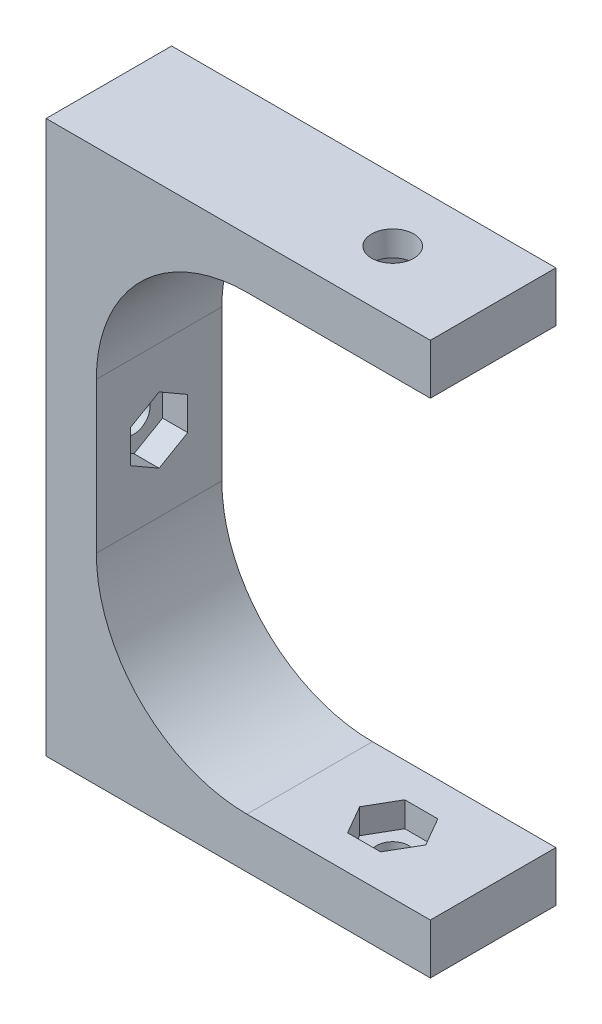
ISO-10303-21;
HEADER;
FILE_DESCRIPTION(('STEP AP214'),'2;1');
FILE_NAME('part.step','',(''),(''),'','','');
FILE_SCHEMA(('AUTOMOTIVE_DESIGN { 1 0 10303 214 1 1 1 1 }'));
ENDSEC;
DATA;
#1=APPLICATION_CONTEXT('core data for automotive mechanical design processes');
#2=APPLICATION_PROTOCOL_DEFINITION('international standard','automotive_design',2000,#1);
#3=PRODUCT_CONTEXT('',#1,'mechanical');
#4=PRODUCT('Part','Part','',(#3));
#5=PRODUCT_RELATED_PRODUCT_CATEGORY('part','',(#4));
#6=PRODUCT_DEFINITION_FORMATION('','',#4);
#7=PRODUCT_DEFINITION_CONTEXT('part definition',#1,'design');
#8=PRODUCT_DEFINITION('design','',#6,#7);
#9=PRODUCT_DEFINITION_SHAPE('','',#8);
#10=(LENGTH_UNIT() NAMED_UNIT(*) SI_UNIT(.MILLI.,.METRE.));
#11=(NAMED_UNIT(*) PLANE_ANGLE_UNIT() SI_UNIT($,.RADIAN.));
#12=(NAMED_UNIT(*) SI_UNIT($,.STERADIAN.) SOLID_ANGLE_UNIT());
#13=UNCERTAINTY_MEASURE_WITH_UNIT(LENGTH_MEASURE(1.E-05),#10,'distance_accuracy_value','');
#14=(GEOMETRIC_REPRESENTATION_CONTEXT(3) GLOBAL_UNCERTAINTY_ASSIGNED_CONTEXT((#13)) GLOBAL_UNIT_ASSIGNED_CONTEXT((#10,
#11,#12)) REPRESENTATION_CONTEXT('',''));
#15=CARTESIAN_POINT('',(0.,0.,0.));
#16=DIRECTION('',(0.,0.,1.));
#17=DIRECTION('',(1.,0.,0.));
#18=AXIS2_PLACEMENT_3D('',#15,#16,#17);
#19=CARTESIAN_POINT('',(0.,0.,6.25));
#20=DIRECTION('',(1.,0.,0.));
#21=DIRECTION('',(0.,1.,0.));
#22=AXIS2_PLACEMENT_3D('',#19,#20,#21);
#23=CYLINDRICAL_SURFACE('',#22,1.6);
#24=CARTESIAN_POINT('',(0.,0.,6.25));
#25=DIRECTION('',(1.,0.,0.));
#26=DIRECTION('',(0.,1.,0.));
#27=AXIS2_PLACEMENT_3D('',#24,#25,#26);
#28=CIRCLE('',#27,1.6);
#29=CARTESIAN_POINT('',(0.,1.60000000000005,6.25));
#30=VERTEX_POINT('',#29);
#31=EDGE_CURVE('E304',#30,#30,#28,.T.);
#32=ORIENTED_EDGE('',*,*,#31,.F.);
#33=EDGE_LOOP('',(#32));
#34=FACE_BOUND('',#33,.T.);
#35=CARTESIAN_POINT('',(2.50000000000001,0.,6.25));
#36=DIRECTION('',(1.,0.,0.));
#37=DIRECTION('',(0.,0.,-1.));
#38=AXIS2_PLACEMENT_3D('',#35,#36,#37);
#39=CIRCLE('',#38,1.6);
#40=CARTESIAN_POINT('',(2.50000000000001,0.,4.65));
#41=VERTEX_POINT('',#40);
#42=EDGE_CURVE('E46',#41,#41,#39,.F.);
#43=ORIENTED_EDGE('',*,*,#42,.F.);
#44=EDGE_LOOP('',(#43));
#45=FACE_BOUND('',#44,.T.);
#46=ADVANCED_FACE('F42',(#34,#45),#23,.F.);
#47=CARTESIAN_POINT('',(28.2666666666667,-27.5,6.25));
#48=DIRECTION('',(0.,1.,0.));
#49=DIRECTION('',(-1.,0.,0.));
#50=AXIS2_PLACEMENT_3D('',#47,#48,#49);
#51=CYLINDRICAL_SURFACE('',#50,1.6);
#52=CARTESIAN_POINT('',(28.2666666666667,-27.5,6.25));
#53=DIRECTION('',(0.,1.,0.));
#54=DIRECTION('',(-1.,0.,0.));
#55=AXIS2_PLACEMENT_3D('',#52,#53,#54);
#56=CIRCLE('',#55,1.6);
#57=CARTESIAN_POINT('',(26.6666666666667,-27.5,6.25));
#58=VERTEX_POINT('',#57);
#59=EDGE_CURVE('E372',#58,#58,#56,.T.);
#60=ORIENTED_EDGE('',*,*,#59,.F.);
#61=EDGE_LOOP('',(#60));
#62=FACE_BOUND('',#61,.T.);
#63=CARTESIAN_POINT('',(28.2666666666667,-25.,6.25));
#64=DIRECTION('',(0.,1.,0.));
#65=DIRECTION('',(0.,0.,1.));
#66=AXIS2_PLACEMENT_3D('',#63,#64,#65);
#67=CIRCLE('',#66,1.6);
#68=CARTESIAN_POINT('',(28.2666666666667,-25.,7.85));
#69=VERTEX_POINT('',#68);
#70=EDGE_CURVE('E357',#69,#69,#67,.F.);
#71=ORIENTED_EDGE('',*,*,#70,.F.);
#72=EDGE_LOOP('',(#71));
#73=FACE_BOUND('',#72,.T.);
#74=ADVANCED_FACE('F554',(#62,#73),#51,.F.);
#75=CARTESIAN_POINT('',(28.2666666666667,16.560303038033,6.25));
#76=DIRECTION('',(0.,1.,0.));
#77=DIRECTION('',(0.,0.,1.));
#78=AXIS2_PLACEMENT_3D('',#75,#76,#77);
#79=CYLINDRICAL_SURFACE('',#78,2.1);
#80=CARTESIAN_POINT('',(28.2666666666667,27.5,6.25));
#81=DIRECTION('',(0.,1.,0.));
#82=DIRECTION('',(0.,0.,1.));
#83=AXIS2_PLACEMENT_3D('',#80,#81,#82);
#84=CIRCLE('',#83,2.1);
#85=CARTESIAN_POINT('',(28.2666666666667,27.5,8.35));
#86=VERTEX_POINT('',#85);
#87=EDGE_CURVE('E443',#86,#86,#84,.T.);
#88=ORIENTED_EDGE('',*,*,#87,.T.);
#89=EDGE_LOOP('',(#88));
#90=FACE_BOUND('',#89,.T.);
#91=CARTESIAN_POINT('',(28.2666666666667,25.,6.25));
#92=DIRECTION('',(0.,-1.,0.));
#93=DIRECTION('',(0.,0.,-1.));
#94=AXIS2_PLACEMENT_3D('',#91,#92,#93);
#95=CIRCLE('',#94,2.1);
#96=CARTESIAN_POINT('',(28.2666666666667,25.,4.15));
#97=VERTEX_POINT('',#96);
#98=EDGE_CURVE('E427',#97,#97,#95,.F.);
#99=ORIENTED_EDGE('',*,*,#98,.F.);
#100=EDGE_LOOP('',(#99));
#101=FACE_BOUND('',#100,.T.);
#102=ADVANCED_FACE('F556',(#90,#101),#79,.F.);
#103=CARTESIAN_POINT('',(0.,27.5,12.5));
#104=DIRECTION('',(0.,-1.,0.));
#105=DIRECTION('',(0.,0.,-1.));
#106=AXIS2_PLACEMENT_3D('',#103,#104,#105);
#107=PLANE('',#106);
#108=ORIENTED_EDGE('',*,*,#87,.F.);
#109=EDGE_LOOP('',(#108));
#110=FACE_BOUND('',#109,.T.);
#111=DIRECTION('',(-1.,0.,0.));
#112=VECTOR('',#111,1.);
#113=CARTESIAN_POINT('',(0.,27.5,0.));
#114=LINE('',#113,#112);
#115=CARTESIAN_POINT('',(38.2666666666667,27.5,0.));
#116=VERTEX_POINT('',#115);
#117=CARTESIAN_POINT('',(0.,27.5,0.));
#118=VERTEX_POINT('',#117);
#119=EDGE_CURVE('E447',#116,#118,#114,.T.);
#120=ORIENTED_EDGE('',*,*,#119,.T.);
#121=DIRECTION('',(0.,0.,-1.));
#122=VECTOR('',#121,1.);
#123=CARTESIAN_POINT('',(0.,27.5,12.5));
#124=LINE('',#123,#122);
#125=CARTESIAN_POINT('',(0.,27.5,12.5));
#126=VERTEX_POINT('',#125);
#127=EDGE_CURVE('E520',#126,#118,#124,.T.);
#128=ORIENTED_EDGE('',*,*,#127,.F.);
#129=DIRECTION('',(-1.,0.,0.));
#130=VECTOR('',#129,1.);
#131=CARTESIAN_POINT('',(0.,27.5,12.5));
#132=LINE('',#131,#130);
#133=CARTESIAN_POINT('',(38.2666666666667,27.5,12.5));
#134=VERTEX_POINT('',#133);
#135=EDGE_CURVE('E448',#134,#126,#132,.T.);
#136=ORIENTED_EDGE('',*,*,#135,.F.);
#137=DIRECTION('',(0.,0.,-1.));
#138=VECTOR('',#137,1.);
#139=CARTESIAN_POINT('',(38.2666666666667,27.5,12.5));
#140=LINE('',#139,#138);
#141=EDGE_CURVE('E476',#134,#116,#140,.T.);
#142=ORIENTED_EDGE('',*,*,#141,.T.);
#143=EDGE_LOOP('',(#120,#128,#136,#142));
#144=FACE_BOUND('',#143,.T.);
#145=ADVANCED_FACE('F563',(#110,#144),#107,.F.);
#146=CARTESIAN_POINT('',(0.,-27.5,12.5));
#147=DIRECTION('',(1.,0.,0.));
#148=DIRECTION('',(0.,0.,-1.));
#149=AXIS2_PLACEMENT_3D('',#146,#147,#148);
#150=PLANE('',#149);
#151=ORIENTED_EDGE('',*,*,#31,.T.);
#152=EDGE_LOOP('',(#151));
#153=FACE_BOUND('',#152,.T.);
#154=DIRECTION('',(0.,-1.,0.));
#155=VECTOR('',#154,1.);
#156=CARTESIAN_POINT('',(0.,-27.5,0.));
#157=LINE('',#156,#155);
#158=CARTESIAN_POINT('',(0.,-27.5,0.));
#159=VERTEX_POINT('',#158);
#160=EDGE_CURVE('E479',#118,#159,#157,.T.);
#161=ORIENTED_EDGE('',*,*,#160,.T.);
#162=DIRECTION('',(0.,0.,-1.));
#163=VECTOR('',#162,1.);
#164=CARTESIAN_POINT('',(0.,-27.5,12.5));
#165=LINE('',#164,#163);
#166=CARTESIAN_POINT('',(0.,-27.5,12.5));
#167=VERTEX_POINT('',#166);
#168=EDGE_CURVE('E516',#167,#159,#165,.T.);
#169=ORIENTED_EDGE('',*,*,#168,.F.);
#170=DIRECTION('',(0.,-1.,0.));
#171=VECTOR('',#170,1.);
#172=CARTESIAN_POINT('',(0.,-27.5,12.5));
#173=LINE('',#172,#171);
#174=EDGE_CURVE('E452',#126,#167,#173,.T.);
#175=ORIENTED_EDGE('',*,*,#174,.F.);
#176=ORIENTED_EDGE('',*,*,#127,.T.);
#177=EDGE_LOOP('',(#161,#169,#175,#176));
#178=FACE_BOUND('',#177,.T.);
#179=ADVANCED_FACE('F633',(#153,#178),#150,.F.);
#180=CARTESIAN_POINT('',(38.2666666666667,-27.5,12.5));
#181=DIRECTION('',(0.,1.,0.));
#182=DIRECTION('',(-1.,0.,0.));
#183=AXIS2_PLACEMENT_3D('',#180,#181,#182);
#184=PLANE('',#183);
#185=ORIENTED_EDGE('',*,*,#59,.T.);
#186=EDGE_LOOP('',(#185));
#187=FACE_BOUND('',#186,.T.);
#188=DIRECTION('',(1.,0.,0.));
#189=VECTOR('',#188,1.);
#190=CARTESIAN_POINT('',(38.2666666666667,-27.5,0.));
#191=LINE('',#190,#189);
#192=CARTESIAN_POINT('',(38.2666666666667,-27.5,0.));
#193=VERTEX_POINT('',#192);
#194=EDGE_CURVE('E482',#159,#193,#191,.T.);
#195=ORIENTED_EDGE('',*,*,#194,.T.);
#196=DIRECTION('',(0.,0.,-1.));
#197=VECTOR('',#196,1.);
#198=CARTESIAN_POINT('',(38.2666666666667,-27.5,12.5));
#199=LINE('',#198,#197);
#200=CARTESIAN_POINT('',(38.2666666666667,-27.5,12.5));
#201=VERTEX_POINT('',#200);
#202=EDGE_CURVE('E512',#201,#193,#199,.T.);
#203=ORIENTED_EDGE('',*,*,#202,.F.);
#204=DIRECTION('',(1.,0.,0.));
#205=VECTOR('',#204,1.);
#206=CARTESIAN_POINT('',(38.2666666666667,-27.5,12.5));
#207=LINE('',#206,#205);
#208=EDGE_CURVE('E456',#167,#201,#207,.T.);
#209=ORIENTED_EDGE('',*,*,#208,.F.);
#210=ORIENTED_EDGE('',*,*,#168,.T.);
#211=EDGE_LOOP('',(#195,#203,#209,#210));
#212=FACE_BOUND('',#211,.T.);
#213=ADVANCED_FACE('F629',(#187,#212),#184,.F.);
#214=CARTESIAN_POINT('',(38.2666666666667,-22.5,12.5));
#215=DIRECTION('',(-1.,0.,0.));
#216=DIRECTION('',(0.,0.,1.));
#217=AXIS2_PLACEMENT_3D('',#214,#215,#216);
#218=PLANE('',#217);
#219=DIRECTION('',(0.,1.,0.));
#220=VECTOR('',#219,1.);
#221=CARTESIAN_POINT('',(38.2666666666667,-22.5,0.));
#222=LINE('',#221,#220);
#223=CARTESIAN_POINT('',(38.2666666666667,-22.5,0.));
#224=VERTEX_POINT('',#223);
#225=EDGE_CURVE('E485',#193,#224,#222,.T.);
#226=ORIENTED_EDGE('',*,*,#225,.T.);
#227=DIRECTION('',(0.,0.,-1.));
#228=VECTOR('',#227,1.);
#229=CARTESIAN_POINT('',(38.2666666666667,-22.5,12.5));
#230=LINE('',#229,#228);
#231=CARTESIAN_POINT('',(38.2666666666667,-22.5,12.5));
#232=VERTEX_POINT('',#231);
#233=EDGE_CURVE('E508',#232,#224,#230,.T.);
#234=ORIENTED_EDGE('',*,*,#233,.F.);
#235=DIRECTION('',(0.,1.,0.));
#236=VECTOR('',#235,1.);
#237=CARTESIAN_POINT('',(38.2666666666667,-22.5,12.5));
#238=LINE('',#237,#236);
#239=EDGE_CURVE('E459',#201,#232,#238,.T.);
#240=ORIENTED_EDGE('',*,*,#239,.F.);
#241=ORIENTED_EDGE('',*,*,#202,.T.);
#242=EDGE_LOOP('',(#226,#234,#240,#241));
#243=FACE_BOUND('',#242,.T.);
#244=ADVANCED_FACE('F625',(#243),#218,.F.);
#245=CARTESIAN_POINT('',(5.00000000000001,-22.5,12.5));
#246=DIRECTION('',(0.,-1.,0.));
#247=DIRECTION('',(0.,0.,-1.));
#248=AXIS2_PLACEMENT_3D('',#245,#246,#247);
#249=PLANE('',#248);
#250=DIRECTION('',(-1.,0.,0.));
#251=VECTOR('',#250,1.);
#252=CARTESIAN_POINT('',(29.9121149338571,-22.5,3.4));
#253=LINE('',#252,#251);
#254=CARTESIAN_POINT('',(29.9121149338571,-22.5,3.4));
#255=VERTEX_POINT('',#254);
#256=CARTESIAN_POINT('',(26.6212183994762,-22.5,3.4));
#257=VERTEX_POINT('',#256);
#258=EDGE_CURVE('E335',#255,#257,#253,.T.);
#259=ORIENTED_EDGE('',*,*,#258,.F.);
#260=DIRECTION('',(-0.5,0.,-0.866025403784439));
#261=VECTOR('',#260,1.);
#262=CARTESIAN_POINT('',(31.5575632010475,-22.5,6.25));
#263=LINE('',#262,#261);
#264=CARTESIAN_POINT('',(31.5575632010475,-22.5,6.25));
#265=VERTEX_POINT('',#264);
#266=EDGE_CURVE('E68',#265,#255,#263,.T.);
#267=ORIENTED_EDGE('',*,*,#266,.F.);
#268=DIRECTION('',(0.5,0.,-0.866025403784439));
#269=VECTOR('',#268,1.);
#270=CARTESIAN_POINT('',(29.9121149338571,-22.5,9.1));
#271=LINE('',#270,#269);
#272=CARTESIAN_POINT('',(29.9121149338571,-22.5,9.1));
#273=VERTEX_POINT('',#272);
#274=EDGE_CURVE('E313',#273,#265,#271,.T.);
#275=ORIENTED_EDGE('',*,*,#274,.F.);
#276=DIRECTION('',(1.,0.,0.));
#277=VECTOR('',#276,1.);
#278=CARTESIAN_POINT('',(26.6212183994762,-22.5,9.1));
#279=LINE('',#278,#277);
#280=CARTESIAN_POINT('',(26.6212183994762,-22.5,9.1));
#281=VERTEX_POINT('',#280);
#282=EDGE_CURVE('E347',#281,#273,#279,.T.);
#283=ORIENTED_EDGE('',*,*,#282,.F.);
#284=DIRECTION('',(0.5,0.,0.866025403784438));
#285=VECTOR('',#284,1.);
#286=CARTESIAN_POINT('',(24.9757701322858,-22.5,6.25));
#287=LINE('',#286,#285);
#288=CARTESIAN_POINT('',(24.9757701322858,-22.5,6.25));
#289=VERTEX_POINT('',#288);
#290=EDGE_CURVE('E343',#289,#281,#287,.T.);
#291=ORIENTED_EDGE('',*,*,#290,.F.);
#292=DIRECTION('',(-0.5,0.,0.866025403784439));
#293=VECTOR('',#292,1.);
#294=CARTESIAN_POINT('',(26.6212183994762,-22.5,3.4));
#295=LINE('',#294,#293);
#296=EDGE_CURVE('E339',#257,#289,#295,.T.);
#297=ORIENTED_EDGE('',*,*,#296,.F.);
#298=EDGE_LOOP('',(#259,#267,#275,#283,#291,#297));
#299=FACE_BOUND('',#298,.T.);
#300=DIRECTION('',(-1.,0.,0.));
#301=VECTOR('',#300,1.);
#302=CARTESIAN_POINT('',(5.00000000000001,-22.5,0.));
#303=LINE('',#302,#301);
#304=CARTESIAN_POINT('',(20.,-22.5,0.));
#305=VERTEX_POINT('',#304);
#306=EDGE_CURVE('E488',#224,#305,#303,.T.);
#307=ORIENTED_EDGE('',*,*,#306,.T.);
#308=DIRECTION('',(0.,0.,-1.));
#309=VECTOR('',#308,1.);
#310=CARTESIAN_POINT('',(20.,-22.5,12.5));
#311=LINE('',#310,#309);
#312=CARTESIAN_POINT('',(20.,-22.5,12.5));
#313=VERTEX_POINT('',#312);
#314=EDGE_CURVE('E531',#305,#313,#311,.F.);
#315=ORIENTED_EDGE('',*,*,#314,.T.);
#316=DIRECTION('',(-1.,0.,0.));
#317=VECTOR('',#316,1.);
#318=CARTESIAN_POINT('',(5.00000000000001,-22.5,12.5));
#319=LINE('',#318,#317);
#320=EDGE_CURVE('E462',#232,#313,#319,.T.);
#321=ORIENTED_EDGE('',*,*,#320,.F.);
#322=ORIENTED_EDGE('',*,*,#233,.T.);
#323=EDGE_LOOP('',(#307,#315,#321,#322));
#324=FACE_BOUND('',#323,.T.);
#325=ADVANCED_FACE('F621',(#299,#324),#249,.F.);
#326=CARTESIAN_POINT('',(5.00000000000001,22.5,12.5));
#327=DIRECTION('',(-1.,0.,0.));
#328=DIRECTION('',(0.,0.,1.));
#329=AXIS2_PLACEMENT_3D('',#326,#327,#328);
#330=PLANE('',#329);
#331=DIRECTION('',(0.,1.,0.));
#332=VECTOR('',#331,1.);
#333=CARTESIAN_POINT('',(5.00000000000001,-1.64544826719038,3.4));
#334=LINE('',#333,#332);
#335=CARTESIAN_POINT('',(5.00000000000001,-1.64544826719038,3.4));
#336=VERTEX_POINT('',#335);
#337=CARTESIAN_POINT('',(5.00000000000001,1.64544826719049,3.4));
#338=VERTEX_POINT('',#337);
#339=EDGE_CURVE('E276',#336,#338,#334,.T.);
#340=ORIENTED_EDGE('',*,*,#339,.F.);
#341=DIRECTION('',(0.,0.500000000000001,-0.866025403784438));
#342=VECTOR('',#341,1.);
#343=CARTESIAN_POINT('',(5.00000000000001,-3.29089653438081,6.25));
#344=LINE('',#343,#342);
#345=CARTESIAN_POINT('',(5.00000000000001,-3.29089653438081,6.25));
#346=VERTEX_POINT('',#345);
#347=EDGE_CURVE('E60',#346,#336,#344,.T.);
#348=ORIENTED_EDGE('',*,*,#347,.F.);
#349=DIRECTION('',(0.,-0.5,-0.866025403784439));
#350=VECTOR('',#349,1.);
#351=CARTESIAN_POINT('',(5.00000000000001,-1.64544826719038,9.1));
#352=LINE('',#351,#350);
#353=CARTESIAN_POINT('',(5.00000000000001,-1.64544826719038,9.1));
#354=VERTEX_POINT('',#353);
#355=EDGE_CURVE('E254',#354,#346,#352,.T.);
#356=ORIENTED_EDGE('',*,*,#355,.F.);
#357=DIRECTION('',(0.,-1.,0.));
#358=VECTOR('',#357,1.);
#359=CARTESIAN_POINT('',(5.00000000000001,1.64544826719049,9.1));
#360=LINE('',#359,#358);
#361=CARTESIAN_POINT('',(5.00000000000001,1.64544826719049,9.1));
#362=VERTEX_POINT('',#361);
#363=EDGE_CURVE('E260',#362,#354,#360,.T.);
#364=ORIENTED_EDGE('',*,*,#363,.F.);
#365=DIRECTION('',(0.,-0.5,0.866025403784438));
#366=VECTOR('',#365,1.);
#367=CARTESIAN_POINT('',(5.00000000000001,3.29089653438092,6.25));
#368=LINE('',#367,#366);
#369=CARTESIAN_POINT('',(5.00000000000001,3.29089653438092,6.25));
#370=VERTEX_POINT('',#369);
#371=EDGE_CURVE('E283',#370,#362,#368,.T.);
#372=ORIENTED_EDGE('',*,*,#371,.F.);
#373=DIRECTION('',(0.,0.5,0.866025403784439));
#374=VECTOR('',#373,1.);
#375=CARTESIAN_POINT('',(5.00000000000001,1.64544826719049,3.4));
#376=LINE('',#375,#374);
#377=EDGE_CURVE('E279',#338,#370,#376,.T.);
#378=ORIENTED_EDGE('',*,*,#377,.F.);
#379=EDGE_LOOP('',(#340,#348,#356,#364,#372,#378));
#380=FACE_BOUND('',#379,.T.);
#381=DIRECTION('',(0.,1.,0.));
#382=VECTOR('',#381,1.);
#383=CARTESIAN_POINT('',(5.00000000000001,22.5,12.5));
#384=LINE('',#383,#382);
#385=CARTESIAN_POINT('',(5.00000000000001,-7.49999999999999,12.5));
#386=VERTEX_POINT('',#385);
#387=CARTESIAN_POINT('',(5.00000000000001,7.5,12.5));
#388=VERTEX_POINT('',#387);
#389=EDGE_CURVE('E466',#386,#388,#384,.T.);
#390=ORIENTED_EDGE('',*,*,#389,.F.);
#391=DIRECTION('',(0.,0.,-1.));
#392=VECTOR('',#391,1.);
#393=CARTESIAN_POINT('',(5.00000000000001,-7.5,0.));
#394=LINE('',#393,#392);
#395=CARTESIAN_POINT('',(5.00000000000001,-7.49999999999999,0.));
#396=VERTEX_POINT('',#395);
#397=EDGE_CURVE('E527',#386,#396,#394,.T.);
#398=ORIENTED_EDGE('',*,*,#397,.T.);
#399=DIRECTION('',(0.,1.,0.));
#400=VECTOR('',#399,1.);
#401=CARTESIAN_POINT('',(5.00000000000001,22.5,0.));
#402=LINE('',#401,#400);
#403=CARTESIAN_POINT('',(5.00000000000001,7.5,0.));
#404=VERTEX_POINT('',#403);
#405=EDGE_CURVE('E492',#396,#404,#402,.T.);
#406=ORIENTED_EDGE('',*,*,#405,.T.);
#407=DIRECTION('',(0.,0.,-1.));
#408=VECTOR('',#407,1.);
#409=CARTESIAN_POINT('',(5.00000000000001,7.5,12.5));
#410=LINE('',#409,#408);
#411=EDGE_CURVE('E524',#404,#388,#410,.F.);
#412=ORIENTED_EDGE('',*,*,#411,.T.);
#413=EDGE_LOOP('',(#390,#398,#406,#412));
#414=FACE_BOUND('',#413,.T.);
#415=ADVANCED_FACE('F617',(#380,#414),#330,.F.);
#416=CARTESIAN_POINT('',(38.2666666666667,22.5,12.5));
#417=DIRECTION('',(0.,1.,0.));
#418=DIRECTION('',(0.,0.,1.));
#419=AXIS2_PLACEMENT_3D('',#416,#417,#418);
#420=PLANE('',#419);
#421=DIRECTION('',(-1.,0.,0.));
#422=VECTOR('',#421,1.);
#423=CARTESIAN_POINT('',(30.3451276357493,22.5,9.85));
#424=LINE('',#423,#422);
#425=CARTESIAN_POINT('',(30.3451276357493,22.5,9.85));
#426=VERTEX_POINT('',#425);
#427=CARTESIAN_POINT('',(26.188205697584,22.5,9.85));
#428=VERTEX_POINT('',#427);
#429=EDGE_CURVE('E405',#426,#428,#424,.T.);
#430=ORIENTED_EDGE('',*,*,#429,.F.);
#431=DIRECTION('',(-0.499999999999999,0.,0.866025403784439));
#432=VECTOR('',#431,1.);
#433=CARTESIAN_POINT('',(32.423588604832,22.5,6.25000000000001));
#434=LINE('',#433,#432);
#435=CARTESIAN_POINT('',(32.423588604832,22.5,6.25000000000001));
#436=VERTEX_POINT('',#435);
#437=EDGE_CURVE('E376',#436,#426,#434,.T.);
#438=ORIENTED_EDGE('',*,*,#437,.F.);
#439=DIRECTION('',(0.5,0.,0.866025403784439));
#440=VECTOR('',#439,1.);
#441=CARTESIAN_POINT('',(30.3451276357493,22.5,2.65000000000001));
#442=LINE('',#441,#440);
#443=CARTESIAN_POINT('',(30.3451276357493,22.5,2.65000000000001));
#444=VERTEX_POINT('',#443);
#445=EDGE_CURVE('E382',#444,#436,#442,.T.);
#446=ORIENTED_EDGE('',*,*,#445,.F.);
#447=DIRECTION('',(1.,0.,0.));
#448=VECTOR('',#447,1.);
#449=CARTESIAN_POINT('',(26.188205697584,22.5,2.65000000000001));
#450=LINE('',#449,#448);
#451=CARTESIAN_POINT('',(26.188205697584,22.5,2.65000000000001));
#452=VERTEX_POINT('',#451);
#453=EDGE_CURVE('E417',#452,#444,#450,.T.);
#454=ORIENTED_EDGE('',*,*,#453,.F.);
#455=DIRECTION('',(0.5,0.,-0.866025403784439));
#456=VECTOR('',#455,1.);
#457=CARTESIAN_POINT('',(24.1097447285014,22.5,6.25));
#458=LINE('',#457,#456);
#459=CARTESIAN_POINT('',(24.1097447285014,22.5,6.25));
#460=VERTEX_POINT('',#459);
#461=EDGE_CURVE('E413',#460,#452,#458,.T.);
#462=ORIENTED_EDGE('',*,*,#461,.F.);
#463=DIRECTION('',(-0.5,0.,-0.866025403784439));
#464=VECTOR('',#463,1.);
#465=CARTESIAN_POINT('',(26.188205697584,22.5,9.85));
#466=LINE('',#465,#464);
#467=EDGE_CURVE('E409',#428,#460,#466,.T.);
#468=ORIENTED_EDGE('',*,*,#467,.F.);
#469=EDGE_LOOP('',(#430,#438,#446,#454,#462,#468));
#470=FACE_BOUND('',#469,.T.);
#471=DIRECTION('',(1.,0.,0.));
#472=VECTOR('',#471,1.);
#473=CARTESIAN_POINT('',(38.2666666666667,22.5,12.5));
#474=LINE('',#473,#472);
#475=CARTESIAN_POINT('',(20.,22.5,12.5));
#476=VERTEX_POINT('',#475);
#477=CARTESIAN_POINT('',(38.2666666666667,22.5,12.5));
#478=VERTEX_POINT('',#477);
#479=EDGE_CURVE('E470',#476,#478,#474,.T.);
#480=ORIENTED_EDGE('',*,*,#479,.F.);
#481=DIRECTION('',(0.,0.,-1.));
#482=VECTOR('',#481,1.);
#483=CARTESIAN_POINT('',(20.,22.5,0.));
#484=LINE('',#483,#482);
#485=CARTESIAN_POINT('',(20.,22.5,0.));
#486=VERTEX_POINT('',#485);
#487=EDGE_CURVE('E534',#476,#486,#484,.T.);
#488=ORIENTED_EDGE('',*,*,#487,.T.);
#489=DIRECTION('',(1.,0.,0.));
#490=VECTOR('',#489,1.);
#491=CARTESIAN_POINT('',(38.2666666666667,22.5,0.));
#492=LINE('',#491,#490);
#493=CARTESIAN_POINT('',(38.2666666666667,22.5,0.));
#494=VERTEX_POINT('',#493);
#495=EDGE_CURVE('E496',#486,#494,#492,.T.);
#496=ORIENTED_EDGE('',*,*,#495,.T.);
#497=DIRECTION('',(0.,0.,-1.));
#498=VECTOR('',#497,1.);
#499=CARTESIAN_POINT('',(38.2666666666667,22.5,12.5));
#500=LINE('',#499,#498);
#501=EDGE_CURVE('E504',#478,#494,#500,.T.);
#502=ORIENTED_EDGE('',*,*,#501,.F.);
#503=EDGE_LOOP('',(#480,#488,#496,#502));
#504=FACE_BOUND('',#503,.T.);
#505=ADVANCED_FACE('F613',(#470,#504),#420,.F.);
#506=CARTESIAN_POINT('',(38.2666666666667,27.5,12.5));
#507=DIRECTION('',(-1.,0.,0.));
#508=DIRECTION('',(0.,0.,1.));
#509=AXIS2_PLACEMENT_3D('',#506,#507,#508);
#510=PLANE('',#509);
#511=DIRECTION('',(0.,1.,0.));
#512=VECTOR('',#511,1.);
#513=CARTESIAN_POINT('',(38.2666666666667,27.5,0.));
#514=LINE('',#513,#512);
#515=EDGE_CURVE('E453',#494,#116,#514,.T.);
#516=ORIENTED_EDGE('',*,*,#515,.T.);
#517=ORIENTED_EDGE('',*,*,#141,.F.);
#518=DIRECTION('',(0.,1.,0.));
#519=VECTOR('',#518,1.);
#520=CARTESIAN_POINT('',(38.2666666666667,27.5,12.5));
#521=LINE('',#520,#519);
#522=EDGE_CURVE('E473',#478,#134,#521,.T.);
#523=ORIENTED_EDGE('',*,*,#522,.F.);
#524=ORIENTED_EDGE('',*,*,#501,.T.);
#525=EDGE_LOOP('',(#516,#517,#523,#524));
#526=FACE_BOUND('',#525,.T.);
#527=ADVANCED_FACE('F605',(#526),#510,.F.);
#528=CARTESIAN_POINT('',(0.,0.,12.5));
#529=DIRECTION('',(0.,0.,-1.));
#530=DIRECTION('',(-1.,0.,0.));
#531=AXIS2_PLACEMENT_3D('',#528,#529,#530);
#532=PLANE('',#531);
#533=ORIENTED_EDGE('',*,*,#135,.T.);
#534=ORIENTED_EDGE('',*,*,#174,.T.);
#535=ORIENTED_EDGE('',*,*,#208,.T.);
#536=ORIENTED_EDGE('',*,*,#239,.T.);
#537=ORIENTED_EDGE('',*,*,#320,.T.);
#538=CARTESIAN_POINT('',(20.,-7.5,12.5));
#539=DIRECTION('',(0.,0.,-1.));
#540=DIRECTION('',(-1.,0.,0.));
#541=AXIS2_PLACEMENT_3D('',#538,#539,#540);
#542=CIRCLE('',#541,15.);
#543=EDGE_CURVE('E541',#313,#386,#542,.T.);
#544=ORIENTED_EDGE('',*,*,#543,.T.);
#545=ORIENTED_EDGE('',*,*,#389,.T.);
#546=CARTESIAN_POINT('',(20.,7.5,12.5));
#547=DIRECTION('',(0.,0.,-1.));
#548=DIRECTION('',(-1.,0.,0.));
#549=AXIS2_PLACEMENT_3D('',#546,#547,#548);
#550=CIRCLE('',#549,15.);
#551=EDGE_CURVE('E11',#388,#476,#550,.T.);
#552=ORIENTED_EDGE('',*,*,#551,.T.);
#553=ORIENTED_EDGE('',*,*,#479,.T.);
#554=ORIENTED_EDGE('',*,*,#522,.T.);
#555=EDGE_LOOP('',(#533,#534,#535,#536,#537,#544,#545,#552,#553,#554));
#556=FACE_BOUND('',#555,.T.);
#557=ADVANCED_FACE('F601',(#556),#532,.F.);
#558=CARTESIAN_POINT('',(0.,0.,0.));
#559=DIRECTION('',(0.,0.,-1.));
#560=DIRECTION('',(-1.,0.,0.));
#561=AXIS2_PLACEMENT_3D('',#558,#559,#560);
#562=PLANE('',#561);
#563=ORIENTED_EDGE('',*,*,#119,.F.);
#564=ORIENTED_EDGE('',*,*,#515,.F.);
#565=ORIENTED_EDGE('',*,*,#495,.F.);
#566=CARTESIAN_POINT('',(20.,7.5,0.));
#567=DIRECTION('',(0.,0.,-1.));
#568=DIRECTION('',(-1.,0.,0.));
#569=AXIS2_PLACEMENT_3D('',#566,#567,#568);
#570=CIRCLE('',#569,15.);
#571=EDGE_CURVE('E52',#486,#404,#570,.F.);
#572=ORIENTED_EDGE('',*,*,#571,.T.);
#573=ORIENTED_EDGE('',*,*,#405,.F.);
#574=CARTESIAN_POINT('',(20.,-7.5,0.));
#575=DIRECTION('',(0.,0.,-1.));
#576=DIRECTION('',(-1.,0.,0.));
#577=AXIS2_PLACEMENT_3D('',#574,#575,#576);
#578=CIRCLE('',#577,15.);
#579=EDGE_CURVE('E538',#396,#305,#578,.F.);
#580=ORIENTED_EDGE('',*,*,#579,.T.);
#581=ORIENTED_EDGE('',*,*,#306,.F.);
#582=ORIENTED_EDGE('',*,*,#225,.F.);
#583=ORIENTED_EDGE('',*,*,#194,.F.);
#584=ORIENTED_EDGE('',*,*,#160,.F.);
#585=EDGE_LOOP('',(#563,#564,#565,#572,#573,#580,#581,#582,#583,#584));
#586=FACE_BOUND('',#585,.T.);
#587=ADVANCED_FACE('F604',(#586),#562,.T.);
#588=CARTESIAN_POINT('',(20.,-7.5,12.5));
#589=DIRECTION('',(0.,0.,1.));
#590=DIRECTION('',(1.,0.,0.));
#591=AXIS2_PLACEMENT_3D('',#588,#589,#590);
#592=CYLINDRICAL_SURFACE('',#591,15.);
#593=ORIENTED_EDGE('',*,*,#543,.F.);
#594=ORIENTED_EDGE('',*,*,#314,.F.);
#595=ORIENTED_EDGE('',*,*,#579,.F.);
#596=ORIENTED_EDGE('',*,*,#397,.F.);
#597=EDGE_LOOP('',(#593,#594,#595,#596));
#598=FACE_BOUND('',#597,.T.);
#599=ADVANCED_FACE('F609',(#598),#592,.F.);
#600=CARTESIAN_POINT('',(20.,7.5,12.5));
#601=DIRECTION('',(0.,0.,1.));
#602=DIRECTION('',(1.,0.,0.));
#603=AXIS2_PLACEMENT_3D('',#600,#601,#602);
#604=CYLINDRICAL_SURFACE('',#603,15.);
#605=ORIENTED_EDGE('',*,*,#551,.F.);
#606=ORIENTED_EDGE('',*,*,#411,.F.);
#607=ORIENTED_EDGE('',*,*,#571,.F.);
#608=ORIENTED_EDGE('',*,*,#487,.F.);
#609=EDGE_LOOP('',(#605,#606,#607,#608));
#610=FACE_BOUND('',#609,.T.);
#611=ADVANCED_FACE('F44',(#610),#604,.F.);
#612=CARTESIAN_POINT('',(0.,25.,0.));
#613=DIRECTION('',(0.,-1.,0.));
#614=DIRECTION('',(0.,0.,-1.));
#615=AXIS2_PLACEMENT_3D('',#612,#613,#614);
#616=PLANE('',#615);
#617=DIRECTION('',(-0.499999999999999,0.,0.866025403784439));
#618=VECTOR('',#617,1.);
#619=CARTESIAN_POINT('',(32.423588604832,25.,6.25000000000001));
#620=LINE('',#619,#618);
#621=CARTESIAN_POINT('',(32.423588604832,25.,6.25000000000001));
#622=VERTEX_POINT('',#621);
#623=CARTESIAN_POINT('',(30.3451276357493,25.,9.85));
#624=VERTEX_POINT('',#623);
#625=EDGE_CURVE('E377',#622,#624,#620,.T.);
#626=ORIENTED_EDGE('',*,*,#625,.T.);
#627=DIRECTION('',(-1.,0.,0.));
#628=VECTOR('',#627,1.);
#629=CARTESIAN_POINT('',(30.3451276357493,25.,9.85));
#630=LINE('',#629,#628);
#631=CARTESIAN_POINT('',(26.188205697584,25.,9.85));
#632=VERTEX_POINT('',#631);
#633=EDGE_CURVE('E381',#624,#632,#630,.T.);
#634=ORIENTED_EDGE('',*,*,#633,.T.);
#635=DIRECTION('',(-0.5,0.,-0.866025403784439));
#636=VECTOR('',#635,1.);
#637=CARTESIAN_POINT('',(26.188205697584,25.,9.85));
#638=LINE('',#637,#636);
#639=CARTESIAN_POINT('',(24.1097447285014,25.,6.25));
#640=VERTEX_POINT('',#639);
#641=EDGE_CURVE('E386',#632,#640,#638,.T.);
#642=ORIENTED_EDGE('',*,*,#641,.T.);
#643=DIRECTION('',(0.5,0.,-0.866025403784439));
#644=VECTOR('',#643,1.);
#645=CARTESIAN_POINT('',(24.1097447285014,25.,6.25));
#646=LINE('',#645,#644);
#647=CARTESIAN_POINT('',(26.188205697584,25.,2.65000000000001));
#648=VERTEX_POINT('',#647);
#649=EDGE_CURVE('E390',#640,#648,#646,.T.);
#650=ORIENTED_EDGE('',*,*,#649,.T.);
#651=DIRECTION('',(1.,0.,0.));
#652=VECTOR('',#651,1.);
#653=CARTESIAN_POINT('',(26.188205697584,25.,2.65000000000001));
#654=LINE('',#653,#652);
#655=CARTESIAN_POINT('',(30.3451276357493,25.,2.65000000000001));
#656=VERTEX_POINT('',#655);
#657=EDGE_CURVE('E394',#648,#656,#654,.T.);
#658=ORIENTED_EDGE('',*,*,#657,.T.);
#659=DIRECTION('',(0.5,0.,0.866025403784439));
#660=VECTOR('',#659,1.);
#661=CARTESIAN_POINT('',(30.3451276357493,25.,2.65000000000001));
#662=LINE('',#661,#660);
#663=EDGE_CURVE('E398',#656,#622,#662,.T.);
#664=ORIENTED_EDGE('',*,*,#663,.T.);
#665=EDGE_LOOP('',(#626,#634,#642,#650,#658,#664));
#666=FACE_BOUND('',#665,.T.);
#667=ORIENTED_EDGE('',*,*,#98,.T.);
#668=EDGE_LOOP('',(#667));
#669=FACE_BOUND('',#668,.T.);
#670=ADVANCED_FACE('F573',(#666,#669),#616,.T.);
#671=CARTESIAN_POINT('',(32.423588604832,25.,6.25000000000001));
#672=DIRECTION('',(0.866025403784439,0.,0.499999999999999));
#673=DIRECTION('',(0.499999999999999,0.,-0.866025403784439));
#674=AXIS2_PLACEMENT_3D('',#671,#672,#673);
#675=PLANE('',#674);
#676=ORIENTED_EDGE('',*,*,#437,.T.);
#677=DIRECTION('',(0.,-1.,0.));
#678=VECTOR('',#677,1.);
#679=CARTESIAN_POINT('',(30.3451276357493,25.,9.85));
#680=LINE('',#679,#678);
#681=EDGE_CURVE('E402',#624,#426,#680,.T.);
#682=ORIENTED_EDGE('',*,*,#681,.F.);
#683=ORIENTED_EDGE('',*,*,#625,.F.);
#684=DIRECTION('',(0.,-1.,0.));
#685=VECTOR('',#684,1.);
#686=CARTESIAN_POINT('',(32.423588604832,25.,6.25000000000001));
#687=LINE('',#686,#685);
#688=EDGE_CURVE('E424',#622,#436,#687,.T.);
#689=ORIENTED_EDGE('',*,*,#688,.T.);
#690=EDGE_LOOP('',(#676,#682,#683,#689));
#691=FACE_BOUND('',#690,.T.);
#692=ADVANCED_FACE('F576',(#691),#675,.F.);
#693=CARTESIAN_POINT('',(30.3451276357493,25.,2.65000000000001));
#694=DIRECTION('',(0.866025403784438,0.,-0.5));
#695=DIRECTION('',(-0.5,0.,-0.866025403784439));
#696=AXIS2_PLACEMENT_3D('',#693,#694,#695);
#697=PLANE('',#696);
#698=ORIENTED_EDGE('',*,*,#445,.T.);
#699=ORIENTED_EDGE('',*,*,#688,.F.);
#700=ORIENTED_EDGE('',*,*,#663,.F.);
#701=DIRECTION('',(0.,-1.,0.));
#702=VECTOR('',#701,1.);
#703=CARTESIAN_POINT('',(30.3451276357493,25.,2.65000000000001));
#704=LINE('',#703,#702);
#705=EDGE_CURVE('E428',#656,#444,#704,.T.);
#706=ORIENTED_EDGE('',*,*,#705,.T.);
#707=EDGE_LOOP('',(#698,#699,#700,#706));
#708=FACE_BOUND('',#707,.T.);
#709=ADVANCED_FACE('F578',(#708),#697,.F.);
#710=CARTESIAN_POINT('',(26.188205697584,25.,2.65000000000001));
#711=DIRECTION('',(0.,0.,-1.));
#712=DIRECTION('',(-1.,0.,0.));
#713=AXIS2_PLACEMENT_3D('',#710,#711,#712);
#714=PLANE('',#713);
#715=ORIENTED_EDGE('',*,*,#453,.T.);
#716=ORIENTED_EDGE('',*,*,#705,.F.);
#717=ORIENTED_EDGE('',*,*,#657,.F.);
#718=DIRECTION('',(0.,-1.,0.));
#719=VECTOR('',#718,1.);
#720=CARTESIAN_POINT('',(26.188205697584,25.,2.65000000000001));
#721=LINE('',#720,#719);
#722=EDGE_CURVE('E431',#648,#452,#721,.T.);
#723=ORIENTED_EDGE('',*,*,#722,.T.);
#724=EDGE_LOOP('',(#715,#716,#717,#723));
#725=FACE_BOUND('',#724,.T.);
#726=ADVANCED_FACE('F581',(#725),#714,.F.);
#727=CARTESIAN_POINT('',(24.1097447285014,25.,6.25));
#728=DIRECTION('',(-0.866025403784439,0.,-0.5));
#729=DIRECTION('',(-0.5,0.,0.866025403784439));
#730=AXIS2_PLACEMENT_3D('',#727,#728,#729);
#731=PLANE('',#730);
#732=ORIENTED_EDGE('',*,*,#461,.T.);
#733=ORIENTED_EDGE('',*,*,#722,.F.);
#734=ORIENTED_EDGE('',*,*,#649,.F.);
#735=DIRECTION('',(0.,-1.,0.));
#736=VECTOR('',#735,1.);
#737=CARTESIAN_POINT('',(24.1097447285014,25.,6.25));
#738=LINE('',#737,#736);
#739=EDGE_CURVE('E434',#640,#460,#738,.T.);
#740=ORIENTED_EDGE('',*,*,#739,.T.);
#741=EDGE_LOOP('',(#732,#733,#734,#740));
#742=FACE_BOUND('',#741,.T.);
#743=ADVANCED_FACE('F585',(#742),#731,.F.);
#744=CARTESIAN_POINT('',(26.188205697584,25.,9.85));
#745=DIRECTION('',(-0.866025403784439,0.,0.5));
#746=DIRECTION('',(0.5,0.,0.866025403784439));
#747=AXIS2_PLACEMENT_3D('',#744,#745,#746);
#748=PLANE('',#747);
#749=ORIENTED_EDGE('',*,*,#467,.T.);
#750=ORIENTED_EDGE('',*,*,#739,.F.);
#751=ORIENTED_EDGE('',*,*,#641,.F.);
#752=DIRECTION('',(0.,-1.,0.));
#753=VECTOR('',#752,1.);
#754=CARTESIAN_POINT('',(26.188205697584,25.,9.85));
#755=LINE('',#754,#753);
#756=EDGE_CURVE('E437',#632,#428,#755,.T.);
#757=ORIENTED_EDGE('',*,*,#756,.T.);
#758=EDGE_LOOP('',(#749,#750,#751,#757));
#759=FACE_BOUND('',#758,.T.);
#760=ADVANCED_FACE('F589',(#759),#748,.F.);
#761=CARTESIAN_POINT('',(30.3451276357493,25.,9.85));
#762=DIRECTION('',(0.,0.,1.));
#763=DIRECTION('',(1.,0.,0.));
#764=AXIS2_PLACEMENT_3D('',#761,#762,#763);
#765=PLANE('',#764);
#766=ORIENTED_EDGE('',*,*,#429,.T.);
#767=ORIENTED_EDGE('',*,*,#756,.F.);
#768=ORIENTED_EDGE('',*,*,#633,.F.);
#769=ORIENTED_EDGE('',*,*,#681,.T.);
#770=EDGE_LOOP('',(#766,#767,#768,#769));
#771=FACE_BOUND('',#770,.T.);
#772=ADVANCED_FACE('F593',(#771),#765,.F.);
#773=CARTESIAN_POINT('',(0.,-25.,0.));
#774=DIRECTION('',(0.,1.,0.));
#775=DIRECTION('',(0.,0.,1.));
#776=AXIS2_PLACEMENT_3D('',#773,#774,#775);
#777=PLANE('',#776);
#778=DIRECTION('',(-0.5,0.,-0.866025403784439));
#779=VECTOR('',#778,1.);
#780=CARTESIAN_POINT('',(31.5575632010475,-25.,6.25));
#781=LINE('',#780,#779);
#782=CARTESIAN_POINT('',(31.5575632010475,-25.,6.25));
#783=VERTEX_POINT('',#782);
#784=CARTESIAN_POINT('',(29.9121149338571,-25.,3.4));
#785=VERTEX_POINT('',#784);
#786=EDGE_CURVE('E308',#783,#785,#781,.T.);
#787=ORIENTED_EDGE('',*,*,#786,.T.);
#788=DIRECTION('',(-1.,0.,0.));
#789=VECTOR('',#788,1.);
#790=CARTESIAN_POINT('',(29.9121149338571,-25.,3.4));
#791=LINE('',#790,#789);
#792=CARTESIAN_POINT('',(26.6212183994762,-25.,3.4));
#793=VERTEX_POINT('',#792);
#794=EDGE_CURVE('E312',#785,#793,#791,.T.);
#795=ORIENTED_EDGE('',*,*,#794,.T.);
#796=DIRECTION('',(-0.5,0.,0.866025403784439));
#797=VECTOR('',#796,1.);
#798=CARTESIAN_POINT('',(26.6212183994762,-25.,3.4));
#799=LINE('',#798,#797);
#800=CARTESIAN_POINT('',(24.9757701322858,-25.,6.25));
#801=VERTEX_POINT('',#800);
#802=EDGE_CURVE('E317',#793,#801,#799,.T.);
#803=ORIENTED_EDGE('',*,*,#802,.T.);
#804=DIRECTION('',(0.5,0.,0.866025403784438));
#805=VECTOR('',#804,1.);
#806=CARTESIAN_POINT('',(24.9757701322858,-25.,6.25));
#807=LINE('',#806,#805);
#808=CARTESIAN_POINT('',(26.6212183994762,-25.,9.1));
#809=VERTEX_POINT('',#808);
#810=EDGE_CURVE('E321',#801,#809,#807,.T.);
#811=ORIENTED_EDGE('',*,*,#810,.T.);
#812=DIRECTION('',(1.,0.,0.));
#813=VECTOR('',#812,1.);
#814=CARTESIAN_POINT('',(26.6212183994762,-25.,9.1));
#815=LINE('',#814,#813);
#816=CARTESIAN_POINT('',(29.9121149338571,-25.,9.1));
#817=VERTEX_POINT('',#816);
#818=EDGE_CURVE('E324',#809,#817,#815,.T.);
#819=ORIENTED_EDGE('',*,*,#818,.T.);
#820=DIRECTION('',(0.5,0.,-0.866025403784439));
#821=VECTOR('',#820,1.);
#822=CARTESIAN_POINT('',(29.9121149338571,-25.,9.1));
#823=LINE('',#822,#821);
#824=EDGE_CURVE('E328',#817,#783,#823,.T.);
#825=ORIENTED_EDGE('',*,*,#824,.T.);
#826=EDGE_LOOP('',(#787,#795,#803,#811,#819,#825));
#827=FACE_BOUND('',#826,.T.);
#828=ORIENTED_EDGE('',*,*,#70,.T.);
#829=EDGE_LOOP('',(#828));
#830=FACE_BOUND('',#829,.T.);
#831=ADVANCED_FACE('F552',(#827,#830),#777,.T.);
#832=CARTESIAN_POINT('',(31.5575632010475,-25.,6.25));
#833=DIRECTION('',(0.866025403784439,0.,-0.5));
#834=DIRECTION('',(-0.5,0.,-0.866025403784439));
#835=AXIS2_PLACEMENT_3D('',#832,#833,#834);
#836=PLANE('',#835);
#837=ORIENTED_EDGE('',*,*,#266,.T.);
#838=DIRECTION('',(0.,1.,0.));
#839=VECTOR('',#838,1.);
#840=CARTESIAN_POINT('',(29.9121149338571,-25.,3.4));
#841=LINE('',#840,#839);
#842=EDGE_CURVE('E332',#785,#255,#841,.T.);
#843=ORIENTED_EDGE('',*,*,#842,.F.);
#844=ORIENTED_EDGE('',*,*,#786,.F.);
#845=DIRECTION('',(0.,1.,0.));
#846=VECTOR('',#845,1.);
#847=CARTESIAN_POINT('',(31.5575632010475,-25.,6.25));
#848=LINE('',#847,#846);
#849=EDGE_CURVE('E354',#783,#265,#848,.T.);
#850=ORIENTED_EDGE('',*,*,#849,.T.);
#851=EDGE_LOOP('',(#837,#843,#844,#850));
#852=FACE_BOUND('',#851,.T.);
#853=ADVANCED_FACE('F571',(#852),#836,.F.);
#854=CARTESIAN_POINT('',(29.9121149338571,-25.,9.1));
#855=DIRECTION('',(0.866025403784439,0.,0.5));
#856=DIRECTION('',(0.5,0.,-0.866025403784439));
#857=AXIS2_PLACEMENT_3D('',#854,#855,#856);
#858=PLANE('',#857);
#859=ORIENTED_EDGE('',*,*,#274,.T.);
#860=ORIENTED_EDGE('',*,*,#849,.F.);
#861=ORIENTED_EDGE('',*,*,#824,.F.);
#862=DIRECTION('',(0.,1.,0.));
#863=VECTOR('',#862,1.);
#864=CARTESIAN_POINT('',(29.9121149338571,-25.,9.1));
#865=LINE('',#864,#863);
#866=EDGE_CURVE('E358',#817,#273,#865,.T.);
#867=ORIENTED_EDGE('',*,*,#866,.T.);
#868=EDGE_LOOP('',(#859,#860,#861,#867));
#869=FACE_BOUND('',#868,.T.);
#870=ADVANCED_FACE('F712',(#869),#858,.F.);
#871=CARTESIAN_POINT('',(26.6212183994762,-25.,9.1));
#872=DIRECTION('',(0.,0.,1.));
#873=DIRECTION('',(1.,0.,0.));
#874=AXIS2_PLACEMENT_3D('',#871,#872,#873);
#875=PLANE('',#874);
#876=ORIENTED_EDGE('',*,*,#282,.T.);
#877=ORIENTED_EDGE('',*,*,#866,.F.);
#878=ORIENTED_EDGE('',*,*,#818,.F.);
#879=DIRECTION('',(0.,1.,0.));
#880=VECTOR('',#879,1.);
#881=CARTESIAN_POINT('',(26.6212183994762,-25.,9.1));
#882=LINE('',#881,#880);
#883=EDGE_CURVE('E361',#809,#281,#882,.T.);
#884=ORIENTED_EDGE('',*,*,#883,.T.);
#885=EDGE_LOOP('',(#876,#877,#878,#884));
#886=FACE_BOUND('',#885,.T.);
#887=ADVANCED_FACE('F717',(#886),#875,.F.);
#888=CARTESIAN_POINT('',(24.9757701322858,-25.,6.25));
#889=DIRECTION('',(-0.866025403784438,0.,0.5));
#890=DIRECTION('',(0.5,0.,0.866025403784438));
#891=AXIS2_PLACEMENT_3D('',#888,#889,#890);
#892=PLANE('',#891);
#893=ORIENTED_EDGE('',*,*,#290,.T.);
#894=ORIENTED_EDGE('',*,*,#883,.F.);
#895=ORIENTED_EDGE('',*,*,#810,.F.);
#896=DIRECTION('',(0.,1.,0.));
#897=VECTOR('',#896,1.);
#898=CARTESIAN_POINT('',(24.9757701322858,-25.,6.25));
#899=LINE('',#898,#897);
#900=EDGE_CURVE('E364',#801,#289,#899,.T.);
#901=ORIENTED_EDGE('',*,*,#900,.T.);
#902=EDGE_LOOP('',(#893,#894,#895,#901));
#903=FACE_BOUND('',#902,.T.);
#904=ADVANCED_FACE('F724',(#903),#892,.F.);
#905=CARTESIAN_POINT('',(26.6212183994762,-25.,3.4));
#906=DIRECTION('',(-0.866025403784439,0.,-0.5));
#907=DIRECTION('',(-0.5,0.,0.866025403784439));
#908=AXIS2_PLACEMENT_3D('',#905,#906,#907);
#909=PLANE('',#908);
#910=ORIENTED_EDGE('',*,*,#296,.T.);
#911=ORIENTED_EDGE('',*,*,#900,.F.);
#912=ORIENTED_EDGE('',*,*,#802,.F.);
#913=DIRECTION('',(0.,1.,0.));
#914=VECTOR('',#913,1.);
#915=CARTESIAN_POINT('',(26.6212183994762,-25.,3.4));
#916=LINE('',#915,#914);
#917=EDGE_CURVE('E367',#793,#257,#916,.T.);
#918=ORIENTED_EDGE('',*,*,#917,.T.);
#919=EDGE_LOOP('',(#910,#911,#912,#918));
#920=FACE_BOUND('',#919,.T.);
#921=ADVANCED_FACE('F731',(#920),#909,.F.);
#922=CARTESIAN_POINT('',(29.9121149338571,-25.,3.4));
#923=DIRECTION('',(0.,0.,-1.));
#924=DIRECTION('',(-1.,0.,0.));
#925=AXIS2_PLACEMENT_3D('',#922,#923,#924);
#926=PLANE('',#925);
#927=ORIENTED_EDGE('',*,*,#258,.T.);
#928=ORIENTED_EDGE('',*,*,#917,.F.);
#929=ORIENTED_EDGE('',*,*,#794,.F.);
#930=ORIENTED_EDGE('',*,*,#842,.T.);
#931=EDGE_LOOP('',(#927,#928,#929,#930));
#932=FACE_BOUND('',#931,.T.);
#933=ADVANCED_FACE('F738',(#932),#926,.F.);
#934=CARTESIAN_POINT('',(2.50000000000001,0.,0.));
#935=DIRECTION('',(1.,0.,0.));
#936=DIRECTION('',(0.,0.,-1.));
#937=AXIS2_PLACEMENT_3D('',#934,#935,#936);
#938=PLANE('',#937);
#939=DIRECTION('',(0.,0.500000000000001,-0.866025403784438));
#940=VECTOR('',#939,1.);
#941=CARTESIAN_POINT('',(2.50000000000001,-3.29089653438081,6.25));
#942=LINE('',#941,#940);
#943=CARTESIAN_POINT('',(2.50000000000001,-3.29089653438081,6.25));
#944=VERTEX_POINT('',#943);
#945=CARTESIAN_POINT('',(2.50000000000001,-1.64544826719038,3.4));
#946=VERTEX_POINT('',#945);
#947=EDGE_CURVE('E231',#944,#946,#942,.T.);
#948=ORIENTED_EDGE('',*,*,#947,.T.);
#949=DIRECTION('',(0.,1.,0.));
#950=VECTOR('',#949,1.);
#951=CARTESIAN_POINT('',(2.50000000000001,-1.64544826719038,3.4));
#952=LINE('',#951,#950);
#953=CARTESIAN_POINT('',(2.50000000000001,1.64544826719049,3.4));
#954=VERTEX_POINT('',#953);
#955=EDGE_CURVE('E241',#946,#954,#952,.T.);
#956=ORIENTED_EDGE('',*,*,#955,.T.);
#957=DIRECTION('',(0.,0.5,0.866025403784439));
#958=VECTOR('',#957,1.);
#959=CARTESIAN_POINT('',(2.50000000000001,1.64544826719049,3.4));
#960=LINE('',#959,#958);
#961=CARTESIAN_POINT('',(2.50000000000001,3.29089653438092,6.25));
#962=VERTEX_POINT('',#961);
#963=EDGE_CURVE('E247',#954,#962,#960,.T.);
#964=ORIENTED_EDGE('',*,*,#963,.T.);
#965=DIRECTION('',(0.,-0.5,0.866025403784438));
#966=VECTOR('',#965,1.);
#967=CARTESIAN_POINT('',(2.50000000000001,3.29089653438092,6.25));
#968=LINE('',#967,#966);
#969=CARTESIAN_POINT('',(2.50000000000001,1.64544826719049,9.1));
#970=VERTEX_POINT('',#969);
#971=EDGE_CURVE('E265',#962,#970,#968,.T.);
#972=ORIENTED_EDGE('',*,*,#971,.T.);
#973=DIRECTION('',(0.,-1.,0.));
#974=VECTOR('',#973,1.);
#975=CARTESIAN_POINT('',(2.50000000000001,1.64544826719049,9.1));
#976=LINE('',#975,#974);
#977=CARTESIAN_POINT('',(2.50000000000001,-1.64544826719038,9.1));
#978=VERTEX_POINT('',#977);
#979=EDGE_CURVE('E269',#970,#978,#976,.T.);
#980=ORIENTED_EDGE('',*,*,#979,.T.);
#981=DIRECTION('',(0.,-0.5,-0.866025403784439));
#982=VECTOR('',#981,1.);
#983=CARTESIAN_POINT('',(2.50000000000001,-1.64544826719038,9.1));
#984=LINE('',#983,#982);
#985=EDGE_CURVE('E238',#978,#944,#984,.T.);
#986=ORIENTED_EDGE('',*,*,#985,.T.);
#987=EDGE_LOOP('',(#948,#956,#964,#972,#980,#986));
#988=FACE_BOUND('',#987,.T.);
#989=ORIENTED_EDGE('',*,*,#42,.T.);
#990=EDGE_LOOP('',(#989));
#991=FACE_BOUND('',#990,.T.);
#992=ADVANCED_FACE('F249',(#988,#991),#938,.T.);
#993=CARTESIAN_POINT('',(2.50000000000001,-3.29089653438081,6.25));
#994=DIRECTION('',(0.,-0.866025403784438,-0.500000000000001));
#995=DIRECTION('',(0.,0.500000000000001,-0.866025403784438));
#996=AXIS2_PLACEMENT_3D('',#993,#994,#995);
#997=PLANE('',#996);
#998=ORIENTED_EDGE('',*,*,#347,.T.);
#999=DIRECTION('',(1.,0.,0.));
#1000=VECTOR('',#999,1.);
#1001=CARTESIAN_POINT('',(2.50000000000001,-1.64544826719038,3.4));
#1002=LINE('',#1001,#1000);
#1003=EDGE_CURVE('E227',#946,#336,#1002,.T.);
#1004=ORIENTED_EDGE('',*,*,#1003,.F.);
#1005=ORIENTED_EDGE('',*,*,#947,.F.);
#1006=DIRECTION('',(1.,0.,0.));
#1007=VECTOR('',#1006,1.);
#1008=CARTESIAN_POINT('',(2.50000000000001,-3.29089653438081,6.25));
#1009=LINE('',#1008,#1007);
#1010=EDGE_CURVE('E290',#944,#346,#1009,.T.);
#1011=ORIENTED_EDGE('',*,*,#1010,.T.);
#1012=EDGE_LOOP('',(#998,#1004,#1005,#1011));
#1013=FACE_BOUND('',#1012,.T.);
#1014=ADVANCED_FACE('F229',(#1013),#997,.F.);
#1015=CARTESIAN_POINT('',(2.50000000000001,-1.64544826719038,9.1));
#1016=DIRECTION('',(0.,-0.866025403784439,0.5));
#1017=DIRECTION('',(0.,-0.5,-0.866025403784439));
#1018=AXIS2_PLACEMENT_3D('',#1015,#1016,#1017);
#1019=PLANE('',#1018);
#1020=ORIENTED_EDGE('',*,*,#355,.T.);
#1021=ORIENTED_EDGE('',*,*,#1010,.F.);
#1022=ORIENTED_EDGE('',*,*,#985,.F.);
#1023=DIRECTION('',(1.,0.,0.));
#1024=VECTOR('',#1023,1.);
#1025=CARTESIAN_POINT('',(2.50000000000001,-1.64544826719038,9.1));
#1026=LINE('',#1025,#1024);
#1027=EDGE_CURVE('E293',#978,#354,#1026,.T.);
#1028=ORIENTED_EDGE('',*,*,#1027,.T.);
#1029=EDGE_LOOP('',(#1020,#1021,#1022,#1028));
#1030=FACE_BOUND('',#1029,.T.);
#1031=ADVANCED_FACE('F755',(#1030),#1019,.F.);
#1032=CARTESIAN_POINT('',(2.50000000000001,1.64544826719049,9.1));
#1033=DIRECTION('',(0.,0.,1.));
#1034=DIRECTION('',(0.,-1.,0.));
#1035=AXIS2_PLACEMENT_3D('',#1032,#1033,#1034);
#1036=PLANE('',#1035);
#1037=ORIENTED_EDGE('',*,*,#363,.T.);
#1038=ORIENTED_EDGE('',*,*,#1027,.F.);
#1039=ORIENTED_EDGE('',*,*,#979,.F.);
#1040=DIRECTION('',(1.,0.,0.));
#1041=VECTOR('',#1040,1.);
#1042=CARTESIAN_POINT('',(2.50000000000001,1.64544826719049,9.1));
#1043=LINE('',#1042,#1041);
#1044=EDGE_CURVE('E296',#970,#362,#1043,.T.);
#1045=ORIENTED_EDGE('',*,*,#1044,.T.);
#1046=EDGE_LOOP('',(#1037,#1038,#1039,#1045));
#1047=FACE_BOUND('',#1046,.T.);
#1048=ADVANCED_FACE('F761',(#1047),#1036,.F.);
#1049=CARTESIAN_POINT('',(2.50000000000001,3.29089653438092,6.25));
#1050=DIRECTION('',(0.,0.866025403784438,0.5));
#1051=DIRECTION('',(0.,-0.5,0.866025403784438));
#1052=AXIS2_PLACEMENT_3D('',#1049,#1050,#1051);
#1053=PLANE('',#1052);
#1054=ORIENTED_EDGE('',*,*,#371,.T.);
#1055=ORIENTED_EDGE('',*,*,#1044,.F.);
#1056=ORIENTED_EDGE('',*,*,#971,.F.);
#1057=DIRECTION('',(1.,0.,0.));
#1058=VECTOR('',#1057,1.);
#1059=CARTESIAN_POINT('',(2.50000000000001,3.29089653438092,6.25));
#1060=LINE('',#1059,#1058);
#1061=EDGE_CURVE('E299',#962,#370,#1060,.T.);
#1062=ORIENTED_EDGE('',*,*,#1061,.T.);
#1063=EDGE_LOOP('',(#1054,#1055,#1056,#1062));
#1064=FACE_BOUND('',#1063,.T.);
#1065=ADVANCED_FACE('F768',(#1064),#1053,.F.);
#1066=CARTESIAN_POINT('',(2.50000000000001,1.64544826719049,3.4));
#1067=DIRECTION('',(0.,0.866025403784439,-0.5));
#1068=DIRECTION('',(0.,0.5,0.866025403784439));
#1069=AXIS2_PLACEMENT_3D('',#1066,#1067,#1068);
#1070=PLANE('',#1069);
#1071=ORIENTED_EDGE('',*,*,#377,.T.);
#1072=ORIENTED_EDGE('',*,*,#1061,.F.);
#1073=ORIENTED_EDGE('',*,*,#963,.F.);
#1074=DIRECTION('',(1.,0.,0.));
#1075=VECTOR('',#1074,1.);
#1076=CARTESIAN_POINT('',(2.50000000000001,1.64544826719049,3.4));
#1077=LINE('',#1076,#1075);
#1078=EDGE_CURVE('E237',#954,#338,#1077,.T.);
#1079=ORIENTED_EDGE('',*,*,#1078,.T.);
#1080=EDGE_LOOP('',(#1071,#1072,#1073,#1079));
#1081=FACE_BOUND('',#1080,.T.);
#1082=ADVANCED_FACE('F775',(#1081),#1070,.F.);
#1083=CARTESIAN_POINT('',(2.50000000000001,-1.64544826719038,3.4));
#1084=DIRECTION('',(0.,0.,-1.));
#1085=DIRECTION('',(0.,1.,0.));
#1086=AXIS2_PLACEMENT_3D('',#1083,#1084,#1085);
#1087=PLANE('',#1086);
#1088=ORIENTED_EDGE('',*,*,#339,.T.);
#1089=ORIENTED_EDGE('',*,*,#1078,.F.);
#1090=ORIENTED_EDGE('',*,*,#955,.F.);
#1091=ORIENTED_EDGE('',*,*,#1003,.T.);
#1092=EDGE_LOOP('',(#1088,#1089,#1090,#1091));
#1093=FACE_BOUND('',#1092,.T.);
#1094=ADVANCED_FACE('F242',(#1093),#1087,.F.);
#1095=CLOSED_SHELL('',(#46,#74,#102,#145,#179,#213,#244,#325,#415,#505,#527,#557,#587,#599,#611,
#670,#692,#709,#726,#743,#760,#772,#831,#853,#870,#887,#904,#921,#933,#992,#1014,#1031,#1048,
#1065,#1082,#1094));
#1096=MANIFOLD_SOLID_BREP('B2',#1095);
#1097=ADVANCED_BREP_SHAPE_REPRESENTATION('',(#18,#1096),#14);
#1098=SHAPE_DEFINITION_REPRESENTATION(#9,#1097);
ENDSEC;
END-ISO-10303-21;
